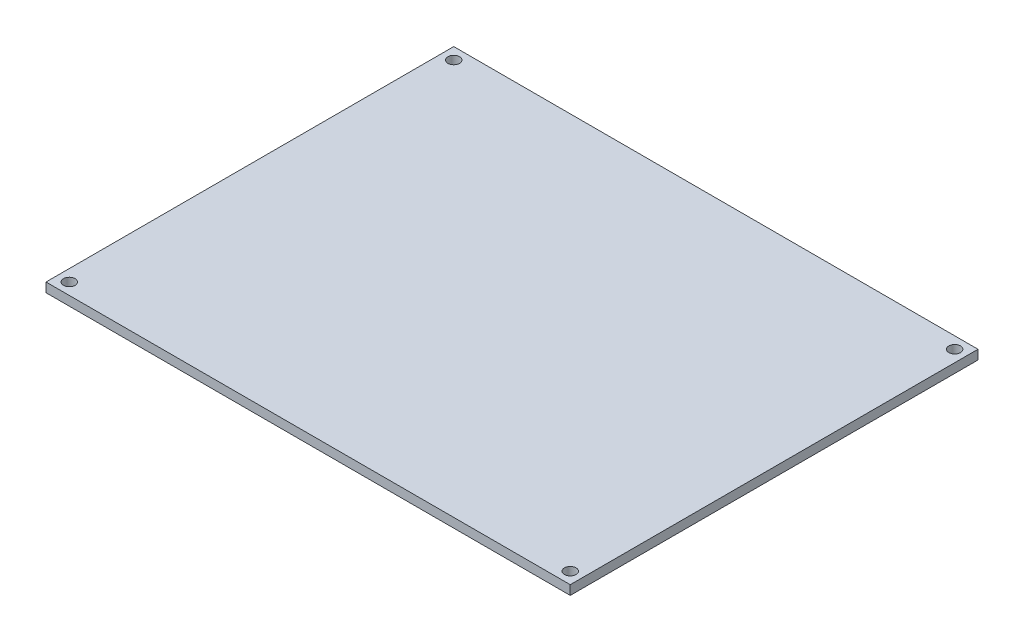
ISO-10303-21;
HEADER;
FILE_DESCRIPTION(('STEP AP214'),'2;1');
FILE_NAME('part.step','',(''),(''),'','','');
FILE_SCHEMA(('AUTOMOTIVE_DESIGN { 1 0 10303 214 1 1 1 1 }'));
ENDSEC;
DATA;
#1=APPLICATION_CONTEXT('core data for automotive mechanical design processes');
#2=APPLICATION_PROTOCOL_DEFINITION('international standard','automotive_design',2000,#1);
#3=PRODUCT_CONTEXT('',#1,'mechanical');
#4=PRODUCT('Part','Part','',(#3));
#5=PRODUCT_RELATED_PRODUCT_CATEGORY('part','',(#4));
#6=PRODUCT_DEFINITION_FORMATION('','',#4);
#7=PRODUCT_DEFINITION_CONTEXT('part definition',#1,'design');
#8=PRODUCT_DEFINITION('design','',#6,#7);
#9=PRODUCT_DEFINITION_SHAPE('','',#8);
#10=(LENGTH_UNIT() NAMED_UNIT(*) SI_UNIT(.MILLI.,.METRE.));
#11=(NAMED_UNIT(*) PLANE_ANGLE_UNIT() SI_UNIT($,.RADIAN.));
#12=(NAMED_UNIT(*) SI_UNIT($,.STERADIAN.) SOLID_ANGLE_UNIT());
#13=UNCERTAINTY_MEASURE_WITH_UNIT(LENGTH_MEASURE(1.E-05),#10,'distance_accuracy_value','');
#14=(GEOMETRIC_REPRESENTATION_CONTEXT(3) GLOBAL_UNCERTAINTY_ASSIGNED_CONTEXT((#13)) GLOBAL_UNIT_ASSIGNED_CONTEXT((#10,
#11,#12)) REPRESENTATION_CONTEXT('',''));
#15=CARTESIAN_POINT('',(0.,0.,0.));
#16=DIRECTION('',(0.,0.,1.));
#17=DIRECTION('',(1.,0.,0.));
#18=AXIS2_PLACEMENT_3D('',#15,#16,#17);
#19=CARTESIAN_POINT('',(0.,1.6,0.));
#20=DIRECTION('',(0.,-1.,0.));
#21=DIRECTION('',(0.,0.,-1.));
#22=AXIS2_PLACEMENT_3D('',#19,#20,#21);
#23=PLANE('',#22);
#24=DIRECTION('',(0.,0.,-1.));
#25=VECTOR('',#24,1.);
#26=CARTESIAN_POINT('',(45.,1.6,35.));
#27=LINE('',#26,#25);
#28=CARTESIAN_POINT('',(45.,1.6,35.));
#29=VERTEX_POINT('',#28);
#30=CARTESIAN_POINT('',(45.,1.6,-35.));
#31=VERTEX_POINT('',#30);
#32=EDGE_CURVE('E98',#29,#31,#27,.T.);
#33=ORIENTED_EDGE('',*,*,#32,.T.);
#34=DIRECTION('',(-1.,0.,0.));
#35=VECTOR('',#34,1.);
#36=CARTESIAN_POINT('',(-45.,1.6,-35.));
#37=LINE('',#36,#35);
#38=CARTESIAN_POINT('',(-45.,1.6,-35.));
#39=VERTEX_POINT('',#38);
#40=EDGE_CURVE('E93',#31,#39,#37,.T.);
#41=ORIENTED_EDGE('',*,*,#40,.T.);
#42=DIRECTION('',(0.,0.,1.));
#43=VECTOR('',#42,1.);
#44=CARTESIAN_POINT('',(-45.,1.6,35.));
#45=LINE('',#44,#43);
#46=CARTESIAN_POINT('',(-45.,1.6,35.));
#47=VERTEX_POINT('',#46);
#48=EDGE_CURVE('E96',#39,#47,#45,.T.);
#49=ORIENTED_EDGE('',*,*,#48,.T.);
#50=DIRECTION('',(1.,0.,0.));
#51=VECTOR('',#50,1.);
#52=CARTESIAN_POINT('',(-45.,1.6,35.));
#53=LINE('',#52,#51);
#54=EDGE_CURVE('E63',#47,#29,#53,.T.);
#55=ORIENTED_EDGE('',*,*,#54,.T.);
#56=EDGE_LOOP('',(#33,#41,#49,#55));
#57=FACE_BOUND('',#56,.T.);
#58=CARTESIAN_POINT('',(-43.,1.6,-33.));
#59=DIRECTION('',(0.,1.,0.));
#60=DIRECTION('',(0.,0.,1.));
#61=AXIS2_PLACEMENT_3D('',#58,#59,#60);
#62=CIRCLE('',#61,0.999999999999998);
#63=CARTESIAN_POINT('',(-43.,1.6,-32.));
#64=VERTEX_POINT('',#63);
#65=EDGE_CURVE('E118',#64,#64,#62,.T.);
#66=ORIENTED_EDGE('',*,*,#65,.F.);
#67=EDGE_LOOP('',(#66));
#68=FACE_BOUND('',#67,.T.);
#69=CARTESIAN_POINT('',(43.,1.6,-33.));
#70=DIRECTION('',(0.,1.,0.));
#71=DIRECTION('',(0.,0.,1.));
#72=AXIS2_PLACEMENT_3D('',#69,#70,#71);
#73=CIRCLE('',#72,0.999999999999998);
#74=CARTESIAN_POINT('',(43.,1.6,-32.));
#75=VERTEX_POINT('',#74);
#76=EDGE_CURVE('E140',#75,#75,#73,.T.);
#77=ORIENTED_EDGE('',*,*,#76,.F.);
#78=EDGE_LOOP('',(#77));
#79=FACE_BOUND('',#78,.T.);
#80=CARTESIAN_POINT('',(-43.,1.6,33.));
#81=DIRECTION('',(0.,1.,0.));
#82=DIRECTION('',(0.,0.,1.));
#83=AXIS2_PLACEMENT_3D('',#80,#81,#82);
#84=CIRCLE('',#83,0.999999999999998);
#85=CARTESIAN_POINT('',(-43.,1.6,34.));
#86=VERTEX_POINT('',#85);
#87=EDGE_CURVE('E148',#86,#86,#84,.T.);
#88=ORIENTED_EDGE('',*,*,#87,.F.);
#89=EDGE_LOOP('',(#88));
#90=FACE_BOUND('',#89,.T.);
#91=CARTESIAN_POINT('',(43.,1.6,33.));
#92=DIRECTION('',(0.,1.,0.));
#93=DIRECTION('',(0.,0.,1.));
#94=AXIS2_PLACEMENT_3D('',#91,#92,#93);
#95=CIRCLE('',#94,0.999999999999998);
#96=CARTESIAN_POINT('',(43.,1.6,34.));
#97=VERTEX_POINT('',#96);
#98=EDGE_CURVE('E156',#97,#97,#95,.T.);
#99=ORIENTED_EDGE('',*,*,#98,.F.);
#100=EDGE_LOOP('',(#99));
#101=FACE_BOUND('',#100,.T.);
#102=ADVANCED_FACE('F45',(#57,#68,#79,#90,#101),#23,.F.);
#103=CARTESIAN_POINT('',(0.,0.,0.));
#104=DIRECTION('',(0.,-1.,0.));
#105=DIRECTION('',(0.,0.,-1.));
#106=AXIS2_PLACEMENT_3D('',#103,#104,#105);
#107=PLANE('',#106);
#108=CARTESIAN_POINT('',(-43.,0.,33.));
#109=DIRECTION('',(0.,1.,0.));
#110=DIRECTION('',(0.,0.,1.));
#111=AXIS2_PLACEMENT_3D('',#108,#109,#110);
#112=CIRCLE('',#111,0.999999999999998);
#113=CARTESIAN_POINT('',(-43.,0.,34.));
#114=VERTEX_POINT('',#113);
#115=EDGE_CURVE('E152',#114,#114,#112,.T.);
#116=ORIENTED_EDGE('',*,*,#115,.T.);
#117=EDGE_LOOP('',(#116));
#118=FACE_BOUND('',#117,.T.);
#119=CARTESIAN_POINT('',(-43.,0.,-33.));
#120=DIRECTION('',(0.,1.,0.));
#121=DIRECTION('',(0.,0.,1.));
#122=AXIS2_PLACEMENT_3D('',#119,#120,#121);
#123=CIRCLE('',#122,0.999999999999998);
#124=CARTESIAN_POINT('',(-43.,0.,-32.));
#125=VERTEX_POINT('',#124);
#126=EDGE_CURVE('E136',#125,#125,#123,.T.);
#127=ORIENTED_EDGE('',*,*,#126,.T.);
#128=EDGE_LOOP('',(#127));
#129=FACE_BOUND('',#128,.T.);
#130=DIRECTION('',(0.,0.,-1.));
#131=VECTOR('',#130,1.);
#132=CARTESIAN_POINT('',(45.,0.,35.));
#133=LINE('',#132,#131);
#134=CARTESIAN_POINT('',(45.,0.,35.));
#135=VERTEX_POINT('',#134);
#136=CARTESIAN_POINT('',(45.,0.,-35.));
#137=VERTEX_POINT('',#136);
#138=EDGE_CURVE('E114',#135,#137,#133,.T.);
#139=ORIENTED_EDGE('',*,*,#138,.F.);
#140=DIRECTION('',(1.,0.,0.));
#141=VECTOR('',#140,1.);
#142=CARTESIAN_POINT('',(-45.,0.,35.));
#143=LINE('',#142,#141);
#144=CARTESIAN_POINT('',(-45.,0.,35.));
#145=VERTEX_POINT('',#144);
#146=EDGE_CURVE('E86',#145,#135,#143,.T.);
#147=ORIENTED_EDGE('',*,*,#146,.F.);
#148=DIRECTION('',(0.,0.,1.));
#149=VECTOR('',#148,1.);
#150=CARTESIAN_POINT('',(-45.,0.,35.));
#151=LINE('',#150,#149);
#152=CARTESIAN_POINT('',(-45.,0.,-35.));
#153=VERTEX_POINT('',#152);
#154=EDGE_CURVE('E80',#153,#145,#151,.T.);
#155=ORIENTED_EDGE('',*,*,#154,.F.);
#156=DIRECTION('',(-1.,0.,0.));
#157=VECTOR('',#156,1.);
#158=CARTESIAN_POINT('',(-45.,0.,-35.));
#159=LINE('',#158,#157);
#160=EDGE_CURVE('E103',#137,#153,#159,.T.);
#161=ORIENTED_EDGE('',*,*,#160,.F.);
#162=EDGE_LOOP('',(#139,#147,#155,#161));
#163=FACE_BOUND('',#162,.T.);
#164=CARTESIAN_POINT('',(43.,0.,-33.));
#165=DIRECTION('',(0.,1.,0.));
#166=DIRECTION('',(0.,0.,1.));
#167=AXIS2_PLACEMENT_3D('',#164,#165,#166);
#168=CIRCLE('',#167,0.999999999999998);
#169=CARTESIAN_POINT('',(43.,0.,-32.));
#170=VERTEX_POINT('',#169);
#171=EDGE_CURVE('E144',#170,#170,#168,.T.);
#172=ORIENTED_EDGE('',*,*,#171,.T.);
#173=EDGE_LOOP('',(#172));
#174=FACE_BOUND('',#173,.T.);
#175=CARTESIAN_POINT('',(43.,0.,33.));
#176=DIRECTION('',(0.,1.,0.));
#177=DIRECTION('',(0.,0.,1.));
#178=AXIS2_PLACEMENT_3D('',#175,#176,#177);
#179=CIRCLE('',#178,0.999999999999998);
#180=CARTESIAN_POINT('',(43.,0.,34.));
#181=VERTEX_POINT('',#180);
#182=EDGE_CURVE('E160',#181,#181,#179,.T.);
#183=ORIENTED_EDGE('',*,*,#182,.T.);
#184=EDGE_LOOP('',(#183));
#185=FACE_BOUND('',#184,.T.);
#186=ADVANCED_FACE('F131',(#118,#129,#163,#174,#185),#107,.T.);
#187=CARTESIAN_POINT('',(45.,1.6,35.));
#188=DIRECTION('',(-1.,0.,0.));
#189=DIRECTION('',(0.,0.,1.));
#190=AXIS2_PLACEMENT_3D('',#187,#188,#189);
#191=PLANE('',#190);
#192=ORIENTED_EDGE('',*,*,#138,.T.);
#193=DIRECTION('',(0.,-1.,0.));
#194=VECTOR('',#193,1.);
#195=CARTESIAN_POINT('',(45.,1.6,-35.));
#196=LINE('',#195,#194);
#197=EDGE_CURVE('E11',#31,#137,#196,.T.);
#198=ORIENTED_EDGE('',*,*,#197,.F.);
#199=ORIENTED_EDGE('',*,*,#32,.F.);
#200=DIRECTION('',(0.,-1.,0.));
#201=VECTOR('',#200,1.);
#202=CARTESIAN_POINT('',(45.,1.6,35.));
#203=LINE('',#202,#201);
#204=EDGE_CURVE('E110',#29,#135,#203,.T.);
#205=ORIENTED_EDGE('',*,*,#204,.T.);
#206=EDGE_LOOP('',(#192,#198,#199,#205));
#207=FACE_BOUND('',#206,.T.);
#208=ADVANCED_FACE('F47',(#207),#191,.F.);
#209=CARTESIAN_POINT('',(-45.,1.6,-35.));
#210=DIRECTION('',(0.,0.,1.));
#211=DIRECTION('',(1.,0.,0.));
#212=AXIS2_PLACEMENT_3D('',#209,#210,#211);
#213=PLANE('',#212);
#214=ORIENTED_EDGE('',*,*,#160,.T.);
#215=DIRECTION('',(0.,-1.,0.));
#216=VECTOR('',#215,1.);
#217=CARTESIAN_POINT('',(-45.,1.6,-35.));
#218=LINE('',#217,#216);
#219=EDGE_CURVE('E55',#39,#153,#218,.T.);
#220=ORIENTED_EDGE('',*,*,#219,.F.);
#221=ORIENTED_EDGE('',*,*,#40,.F.);
#222=ORIENTED_EDGE('',*,*,#197,.T.);
#223=EDGE_LOOP('',(#214,#220,#221,#222));
#224=FACE_BOUND('',#223,.T.);
#225=ADVANCED_FACE('F102',(#224),#213,.F.);
#226=CARTESIAN_POINT('',(-45.,1.6,35.));
#227=DIRECTION('',(1.,0.,0.));
#228=DIRECTION('',(0.,0.,-1.));
#229=AXIS2_PLACEMENT_3D('',#226,#227,#228);
#230=PLANE('',#229);
#231=ORIENTED_EDGE('',*,*,#154,.T.);
#232=DIRECTION('',(0.,-1.,0.));
#233=VECTOR('',#232,1.);
#234=CARTESIAN_POINT('',(-45.,1.6,35.));
#235=LINE('',#234,#233);
#236=EDGE_CURVE('E105',#47,#145,#235,.T.);
#237=ORIENTED_EDGE('',*,*,#236,.F.);
#238=ORIENTED_EDGE('',*,*,#48,.F.);
#239=ORIENTED_EDGE('',*,*,#219,.T.);
#240=EDGE_LOOP('',(#231,#237,#238,#239));
#241=FACE_BOUND('',#240,.T.);
#242=ADVANCED_FACE('F106',(#241),#230,.F.);
#243=CARTESIAN_POINT('',(-45.,1.6,35.));
#244=DIRECTION('',(0.,0.,-1.));
#245=DIRECTION('',(-1.,0.,0.));
#246=AXIS2_PLACEMENT_3D('',#243,#244,#245);
#247=PLANE('',#246);
#248=ORIENTED_EDGE('',*,*,#146,.T.);
#249=ORIENTED_EDGE('',*,*,#204,.F.);
#250=ORIENTED_EDGE('',*,*,#54,.F.);
#251=ORIENTED_EDGE('',*,*,#236,.T.);
#252=EDGE_LOOP('',(#248,#249,#250,#251));
#253=FACE_BOUND('',#252,.T.);
#254=ADVANCED_FACE('F128',(#253),#247,.F.);
#255=CARTESIAN_POINT('',(-43.,1.6,-33.));
#256=DIRECTION('',(0.,-1.,0.));
#257=DIRECTION('',(0.,0.,-1.));
#258=AXIS2_PLACEMENT_3D('',#255,#256,#257);
#259=CYLINDRICAL_SURFACE('',#258,0.999999999999998);
#260=ORIENTED_EDGE('',*,*,#65,.T.);
#261=EDGE_LOOP('',(#260));
#262=FACE_BOUND('',#261,.T.);
#263=ORIENTED_EDGE('',*,*,#126,.F.);
#264=EDGE_LOOP('',(#263));
#265=FACE_BOUND('',#264,.T.);
#266=ADVANCED_FACE('F179',(#262,#265),#259,.F.);
#267=CARTESIAN_POINT('',(43.,1.6,-33.));
#268=DIRECTION('',(0.,-1.,0.));
#269=DIRECTION('',(0.,0.,-1.));
#270=AXIS2_PLACEMENT_3D('',#267,#268,#269);
#271=CYLINDRICAL_SURFACE('',#270,0.999999999999998);
#272=ORIENTED_EDGE('',*,*,#76,.T.);
#273=EDGE_LOOP('',(#272));
#274=FACE_BOUND('',#273,.T.);
#275=ORIENTED_EDGE('',*,*,#171,.F.);
#276=EDGE_LOOP('',(#275));
#277=FACE_BOUND('',#276,.T.);
#278=ADVANCED_FACE('F224',(#274,#277),#271,.F.);
#279=CARTESIAN_POINT('',(-43.,1.6,33.));
#280=DIRECTION('',(0.,-1.,0.));
#281=DIRECTION('',(0.,0.,-1.));
#282=AXIS2_PLACEMENT_3D('',#279,#280,#281);
#283=CYLINDRICAL_SURFACE('',#282,0.999999999999998);
#284=ORIENTED_EDGE('',*,*,#87,.T.);
#285=EDGE_LOOP('',(#284));
#286=FACE_BOUND('',#285,.T.);
#287=ORIENTED_EDGE('',*,*,#115,.F.);
#288=EDGE_LOOP('',(#287));
#289=FACE_BOUND('',#288,.T.);
#290=ADVANCED_FACE('F232',(#286,#289),#283,.F.);
#291=CARTESIAN_POINT('',(43.,1.6,33.));
#292=DIRECTION('',(0.,-1.,0.));
#293=DIRECTION('',(0.,0.,-1.));
#294=AXIS2_PLACEMENT_3D('',#291,#292,#293);
#295=CYLINDRICAL_SURFACE('',#294,0.999999999999998);
#296=ORIENTED_EDGE('',*,*,#98,.T.);
#297=EDGE_LOOP('',(#296));
#298=FACE_BOUND('',#297,.T.);
#299=ORIENTED_EDGE('',*,*,#182,.F.);
#300=EDGE_LOOP('',(#299));
#301=FACE_BOUND('',#300,.T.);
#302=ADVANCED_FACE('F168',(#298,#301),#295,.F.);
#303=CLOSED_SHELL('',(#102,#186,#208,#225,#242,#254,#266,#278,#290,#302));
#304=MANIFOLD_SOLID_BREP('B2',#303);
#305=ADVANCED_BREP_SHAPE_REPRESENTATION('',(#18,#304),#14);
#306=SHAPE_DEFINITION_REPRESENTATION(#9,#305);
ENDSEC;
END-ISO-10303-21;
